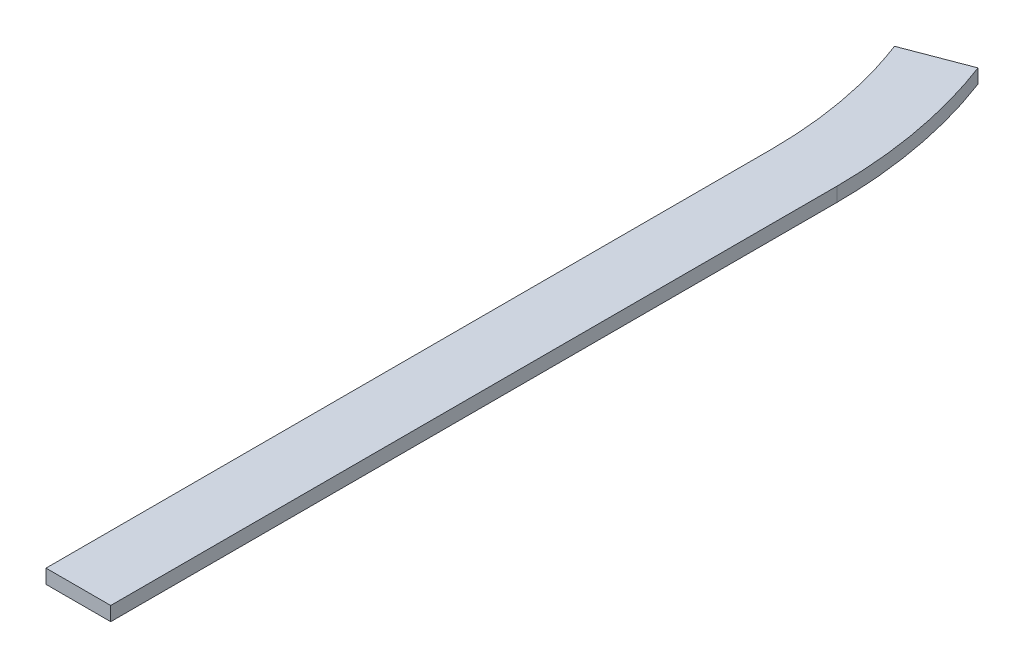
ISO-10303-21;
HEADER;
FILE_DESCRIPTION(('STEP AP214'),'2;1');
FILE_NAME('part.step','',(''),(''),'','','');
FILE_SCHEMA(('AUTOMOTIVE_DESIGN { 1 0 10303 214 1 1 1 1 }'));
ENDSEC;
DATA;
#1=APPLICATION_CONTEXT('core data for automotive mechanical design processes');
#2=APPLICATION_PROTOCOL_DEFINITION('international standard','automotive_design',2000,#1);
#3=PRODUCT_CONTEXT('',#1,'mechanical');
#4=PRODUCT('Part','Part','',(#3));
#5=PRODUCT_RELATED_PRODUCT_CATEGORY('part','',(#4));
#6=PRODUCT_DEFINITION_FORMATION('','',#4);
#7=PRODUCT_DEFINITION_CONTEXT('part definition',#1,'design');
#8=PRODUCT_DEFINITION('design','',#6,#7);
#9=PRODUCT_DEFINITION_SHAPE('','',#8);
#10=(LENGTH_UNIT() NAMED_UNIT(*) SI_UNIT(.MILLI.,.METRE.));
#11=(NAMED_UNIT(*) PLANE_ANGLE_UNIT() SI_UNIT($,.RADIAN.));
#12=(NAMED_UNIT(*) SI_UNIT($,.STERADIAN.) SOLID_ANGLE_UNIT());
#13=UNCERTAINTY_MEASURE_WITH_UNIT(LENGTH_MEASURE(1.E-05),#10,'distance_accuracy_value','');
#14=(GEOMETRIC_REPRESENTATION_CONTEXT(3) GLOBAL_UNCERTAINTY_ASSIGNED_CONTEXT((#13)) GLOBAL_UNIT_ASSIGNED_CONTEXT((#10,
#11,#12)) REPRESENTATION_CONTEXT('',''));
#15=CARTESIAN_POINT('',(0.,0.,0.));
#16=DIRECTION('',(0.,0.,1.));
#17=DIRECTION('',(1.,0.,0.));
#18=AXIS2_PLACEMENT_3D('',#15,#16,#17);
#19=CARTESIAN_POINT('',(206.7634024997,-29.78019545791,-73.80424620326));
#20=DIRECTION('',(-4.21492200817009E-05,-0.99999999911172,5.0767072896601E-08));
#21=DIRECTION('',(0.999999999111722,-4.21492200817009E-05,0.));
#22=AXIS2_PLACEMENT_3D('',#19,#20,#21);
#23=PLANE('',#22);
#24=CARTESIAN_POINT('',(205.25,-29.78011162292,-68.79760261843));
#25=DIRECTION('',(0.,3.94278385506426E-06,0.999999999992227));
#26=VECTOR('',#25,1.);
#27=LINE('',#24,#26);
#28=CARTESIAN_POINT('',(205.249996809701,-29.7801211398774,-68.7976026184295));
#29=VERTEX_POINT('',#28);
#30=CARTESIAN_POINT('',(205.249999997802,-29.7800104932,-24.4496014755466));
#31=VERTEX_POINT('',#30);
#32=EDGE_CURVE('E119',#29,#31,#27,.T.);
#33=ORIENTED_EDGE('',*,*,#32,.F.);
#34=CARTESIAN_POINT('',(205.249993622066,-29.7801314147334,-68.797602618429));
#35=CARTESIAN_POINT('',(205.246957911475,-29.7801314057516,-71.1410710367587));
#36=CARTESIAN_POINT('',(204.821149370431,-29.7801135752726,-73.4460867888181));
#37=CARTESIAN_POINT('',(204.395439095039,-29.7800957489084,-75.7505706025733));
#38=CARTESIAN_POINT('',(203.560733778747,-29.7800606779287,-77.9409355077226));
#39=B_SPLINE_CURVE_WITH_KNOTS('',2,(#34,#35,#36,#37,#38),.UNSPECIFIED.,.F.,.F.,(3,2,3),(0.,0.5,
1.),.UNSPECIFIED.);
#40=CARTESIAN_POINT('',(203.56073377768,-29.7800861504244,-77.9409355077238));
#41=VERTEX_POINT('',#40);
#42=EDGE_CURVE('E81',#29,#41,#39,.T.);
#43=ORIENTED_EDGE('',*,*,#42,.T.);
#44=CARTESIAN_POINT('',(203.560733778744,-29.7800606779287,-77.9409355077218));
#45=DIRECTION('',(0.934447905490676,-3.94043286061888E-05,-0.356099860111439));
#46=VECTOR('',#45,1.);
#47=LINE('',#44,#46);
#48=CARTESIAN_POINT('',(207.251803006735,-29.7802173943607,-79.3475299554304));
#49=VERTEX_POINT('',#48);
#50=EDGE_CURVE('E77',#41,#49,#47,.T.);
#51=ORIENTED_EDGE('',*,*,#50,.T.);
#52=CARTESIAN_POINT('',(179.4799540302,-29.7790452259675,-68.76422031162));
#53=DIRECTION('',(-4.21492200817009E-05,-0.99999999911172,5.0767072896601E-08));
#54=DIRECTION('',(0.999999273749899,-4.21492506551581E-05,-0.00120445967751251));
#55=AXIS2_PLACEMENT_3D('',#52,#53,#54);
#56=ELLIPSE('',#55,29.7200612406497,29.72006121425);
#57=CARTESIAN_POINT('',(209.199995453254,-29.7802878036051,-68.8000169255531));
#58=VERTEX_POINT('',#57);
#59=EDGE_CURVE('E97',#58,#49,#56,.F.);
#60=ORIENTED_EDGE('',*,*,#59,.F.);
#61=CARTESIAN_POINT('',(209.199993685891,-29.7802979042782,-68.800016925609));
#62=DIRECTION('',(2.13975096230523E-12,5.07670728685124E-08,0.999999999999999));
#63=VECTOR('',#62,1.);
#64=LINE('',#61,#63);
#65=CARTESIAN_POINT('',(209.199998899564,-29.7801220627695,-24.4503876636462));
#66=VERTEX_POINT('',#65);
#67=EDGE_CURVE('E106',#58,#66,#64,.T.);
#68=ORIENTED_EDGE('',*,*,#67,.T.);
#69=CARTESIAN_POINT('',(205.2500000014,-29.77993676675,-24.4499919380715));
#70=DIRECTION('',(0.999999999725808,-2.34162455564243E-05,2.52188111134767E-07));
#71=VECTOR('',#70,1.);
#72=LINE('',#69,#71);
#73=EDGE_CURVE('E112',#31,#66,#72,.T.);
#74=ORIENTED_EDGE('',*,*,#73,.F.);
#75=EDGE_LOOP('',(#33,#43,#51,#60,#68,#74));
#76=FACE_BOUND('',#75,.T.);
#77=ADVANCED_FACE('F17',(#76),#23,.T.);
#78=CARTESIAN_POINT('',(205.4062683915,-29.35014171264,-78.64423273164));
#79=DIRECTION('',(0.356099860213881,0.,0.93444790628245));
#80=DIRECTION('',(0.93444790628245,0.,-0.356099860213881));
#81=AXIS2_PLACEMENT_3D('',#78,#79,#80);
#82=PLANE('',#81);
#83=DIRECTION('',(0.,-1.,0.));
#84=VECTOR('',#83,1.);
#85=CARTESIAN_POINT('',(203.560733776622,-54.,-77.9409355077285));
#86=LINE('',#85,#84);
#87=CARTESIAN_POINT('',(203.560733776624,-28.9200800143289,-77.9409355077244));
#88=VERTEX_POINT('',#87);
#89=EDGE_CURVE('E74',#41,#88,#86,.F.);
#90=ORIENTED_EDGE('',*,*,#89,.T.);
#91=DIRECTION('',(-0.934447906064635,-2.15448378892588E-05,0.356099860133696));
#92=VECTOR('',#91,1.);
#93=CARTESIAN_POINT('',(207.251803006202,-28.9199949122192,-79.3475299554847));
#94=LINE('',#93,#92);
#95=CARTESIAN_POINT('',(207.251803006506,-28.9199949122192,-79.3475299553957));
#96=VERTEX_POINT('',#95);
#97=EDGE_CURVE('E70',#96,#88,#94,.T.);
#98=ORIENTED_EDGE('',*,*,#97,.F.);
#99=DIRECTION('',(0.,-1.,0.));
#100=VECTOR('',#99,1.);
#101=CARTESIAN_POINT('',(207.251803006574,-54.,-79.347529955217));
#102=LINE('',#101,#100);
#103=EDGE_CURVE('E95',#49,#96,#102,.F.);
#104=ORIENTED_EDGE('',*,*,#103,.F.);
#105=ORIENTED_EDGE('',*,*,#50,.F.);
#106=EDGE_LOOP('',(#90,#98,#104,#105));
#107=FACE_BOUND('',#106,.T.);
#108=ADVANCED_FACE('F76',(#107),#82,.F.);
#109=CARTESIAN_POINT('',(179.4799540302,-54.,-68.76422031162));
#110=DIRECTION('',(0.,-1.,0.));
#111=DIRECTION('',(0.,0.,-1.));
#112=AXIS2_PLACEMENT_3D('',#109,#110,#111);
#113=CYLINDRICAL_SURFACE('',#112,25.77006121425);
#114=ORIENTED_EDGE('',*,*,#42,.F.);
#115=CARTESIAN_POINT('',(205.25,-28.92013762608,-68.79962042966));
#116=DIRECTION('',(0.,-0.999997247301531,0.00234635661424821));
#117=VECTOR('',#116,1.);
#118=LINE('',#115,#117);
#119=CARTESIAN_POINT('',(205.249995237719,-28.9201271351301,-68.7996204300372));
#120=VERTEX_POINT('',#119);
#121=EDGE_CURVE('E80',#120,#29,#118,.T.);
#122=ORIENTED_EDGE('',*,*,#121,.F.);
#123=CARTESIAN_POINT('',(179.4799540302,-28.9206352261203,-68.76422031162));
#124=DIRECTION('',(-2.01325286569302E-05,0.99999999976791,7.67211376074008E-06));
#125=DIRECTION('',(-0.934447906065582,-2.15448378893844E-05,0.356099860131214));
#126=AXIS2_PLACEMENT_3D('',#123,#124,#125);
#127=ELLIPSE('',#126,25.770061220231,25.77006121425);
#128=EDGE_CURVE('E84',#88,#120,#127,.F.);
#129=ORIENTED_EDGE('',*,*,#128,.F.);
#130=ORIENTED_EDGE('',*,*,#89,.F.);
#131=EDGE_LOOP('',(#114,#122,#129,#130));
#132=FACE_BOUND('',#131,.T.);
#133=ADVANCED_FACE('F85',(#132),#113,.F.);
#134=CARTESIAN_POINT('',(205.25,-54.,-68.8));
#135=DIRECTION('',(-1.,0.,0.));
#136=DIRECTION('',(0.,0.,1.));
#137=AXIS2_PLACEMENT_3D('',#134,#135,#136);
#138=PLANE('',#137);
#139=CARTESIAN_POINT('',(205.2500000014,-28.92032981109,-24.4499919380715));
#140=DIRECTION('',(0.,-1.,0.));
#141=VECTOR('',#140,1.);
#142=LINE('',#139,#141);
#143=CARTESIAN_POINT('',(205.249997997597,-28.9203931498061,-24.4499919385894));
#144=VERTEX_POINT('',#143);
#145=EDGE_CURVE('E116',#144,#31,#142,.T.);
#146=ORIENTED_EDGE('',*,*,#145,.F.);
#147=DIRECTION('',(0.,-7.6721137622949E-06,0.999999999970569));
#148=VECTOR('',#147,1.);
#149=CARTESIAN_POINT('',(205.25,-28.9200777422792,-73.8042462034938));
#150=LINE('',#149,#148);
#151=EDGE_CURVE('E91',#120,#144,#150,.T.);
#152=ORIENTED_EDGE('',*,*,#151,.F.);
#153=ORIENTED_EDGE('',*,*,#121,.T.);
#154=ORIENTED_EDGE('',*,*,#32,.T.);
#155=EDGE_LOOP('',(#146,#152,#153,#154));
#156=FACE_BOUND('',#155,.T.);
#157=ADVANCED_FACE('F125',(#156),#138,.T.);
#158=CARTESIAN_POINT('',(207.2249999365,-29.34995915868,-24.44999144));
#159=DIRECTION('',(-2.52188111419492E-07,0.,0.999999999999968));
#160=DIRECTION('',(0.999999999999968,0.,2.52188111419492E-07));
#161=AXIS2_PLACEMENT_3D('',#158,#159,#160);
#162=PLANE('',#161);
#163=ORIENTED_EDGE('',*,*,#73,.T.);
#164=CARTESIAN_POINT('',(209.2000000027,-29.78002926092,-24.4499909419285));
#165=DIRECTION('',(0.,1.,0.));
#166=VECTOR('',#165,1.);
#167=LINE('',#164,#166);
#168=CARTESIAN_POINT('',(209.200000002266,-28.9203460300003,-24.4499914267031));
#169=VERTEX_POINT('',#168);
#170=EDGE_CURVE('E104',#66,#169,#167,.T.);
#171=ORIENTED_EDGE('',*,*,#170,.T.);
#172=DIRECTION('',(-0.999999999797341,-2.01325286575227E-05,0.));
#173=VECTOR('',#172,1.);
#174=CARTESIAN_POINT('',(206.763402507323,-28.9204259251132,-24.4499919394512));
#175=LINE('',#174,#173);
#176=EDGE_CURVE('E255',#144,#169,#175,.F.);
#177=ORIENTED_EDGE('',*,*,#176,.F.);
#178=ORIENTED_EDGE('',*,*,#145,.T.);
#179=EDGE_LOOP('',(#163,#171,#177,#178));
#180=FACE_BOUND('',#179,.T.);
#181=ADVANCED_FACE('F144',(#180),#162,.T.);
#182=CARTESIAN_POINT('',(209.2,-54.,-68.8));
#183=DIRECTION('',(-1.,0.,0.));
#184=DIRECTION('',(0.,0.,1.));
#185=AXIS2_PLACEMENT_3D('',#182,#183,#184);
#186=PLANE('',#185);
#187=ORIENTED_EDGE('',*,*,#67,.F.);
#188=CARTESIAN_POINT('',(209.199993686654,-28.92000472261,-68.80001692547));
#189=DIRECTION('',(0.,-1.,0.));
#190=VECTOR('',#189,1.);
#191=LINE('',#188,#190);
#192=CARTESIAN_POINT('',(209.199996843002,-28.9200206671455,-68.8000169255923));
#193=VERTEX_POINT('',#192);
#194=EDGE_CURVE('E36',#193,#58,#191,.T.);
#195=ORIENTED_EDGE('',*,*,#194,.F.);
#196=DIRECTION('',(1.54459050151874E-10,-7.67211375918525E-06,0.999999999970569));
#197=VECTOR('',#196,1.);
#198=CARTESIAN_POINT('',(209.199999996619,-28.9199982187911,-73.80424620326));
#199=LINE('',#198,#197);
#200=EDGE_CURVE('E27',#169,#193,#199,.F.);
#201=ORIENTED_EDGE('',*,*,#200,.F.);
#202=ORIENTED_EDGE('',*,*,#170,.F.);
#203=EDGE_LOOP('',(#187,#195,#201,#202));
#204=FACE_BOUND('',#203,.T.);
#205=ADVANCED_FACE('F207',(#204),#186,.F.);
#206=CARTESIAN_POINT('',(179.4799540302,-54.,-68.76422031162));
#207=DIRECTION('',(0.,-1.,0.));
#208=DIRECTION('',(0.,0.,-1.));
#209=AXIS2_PLACEMENT_3D('',#206,#207,#208);
#210=CYLINDRICAL_SURFACE('',#209,29.72006121425);
#211=ORIENTED_EDGE('',*,*,#103,.T.);
#212=CARTESIAN_POINT('',(179.4799540302,-28.9206352261203,-68.76422031162));
#213=DIRECTION('',(-2.01325286569302E-05,0.99999999976791,7.67211376074008E-06));
#214=DIRECTION('',(-0.934447906065582,-2.15448378893844E-05,0.356099860131214));
#215=AXIS2_PLACEMENT_3D('',#212,#213,#214);
#216=ELLIPSE('',#215,29.7200612211477,29.72006121425);
#217=EDGE_CURVE('E11',#193,#96,#216,.T.);
#218=ORIENTED_EDGE('',*,*,#217,.F.);
#219=ORIENTED_EDGE('',*,*,#194,.T.);
#220=ORIENTED_EDGE('',*,*,#59,.T.);
#221=EDGE_LOOP('',(#211,#218,#219,#220));
#222=FACE_BOUND('',#221,.T.);
#223=ADVANCED_FACE('F216',(#222),#210,.T.);
#224=CARTESIAN_POINT('',(206.7634024997,-28.92004727366,-73.80424620326));
#225=DIRECTION('',(-2.01325286569302E-05,0.99999999976791,7.67211376074008E-06));
#226=DIRECTION('',(-0.999999999797341,-2.01325286575227E-05,0.));
#227=AXIS2_PLACEMENT_3D('',#224,#225,#226);
#228=PLANE('',#227);
#229=ORIENTED_EDGE('',*,*,#200,.T.);
#230=ORIENTED_EDGE('',*,*,#217,.T.);
#231=ORIENTED_EDGE('',*,*,#97,.T.);
#232=ORIENTED_EDGE('',*,*,#128,.T.);
#233=ORIENTED_EDGE('',*,*,#151,.T.);
#234=ORIENTED_EDGE('',*,*,#176,.T.);
#235=EDGE_LOOP('',(#229,#230,#231,#232,#233,#234));
#236=FACE_BOUND('',#235,.T.);
#237=ADVANCED_FACE('F94',(#236),#228,.T.);
#238=CLOSED_SHELL('',(#77,#108,#133,#157,#181,#205,#223,#237));
#239=MANIFOLD_SOLID_BREP('B1',#238);
#240=ADVANCED_BREP_SHAPE_REPRESENTATION('',(#18,#239),#14);
#241=SHAPE_DEFINITION_REPRESENTATION(#9,#240);
ENDSEC;
END-ISO-10303-21;
